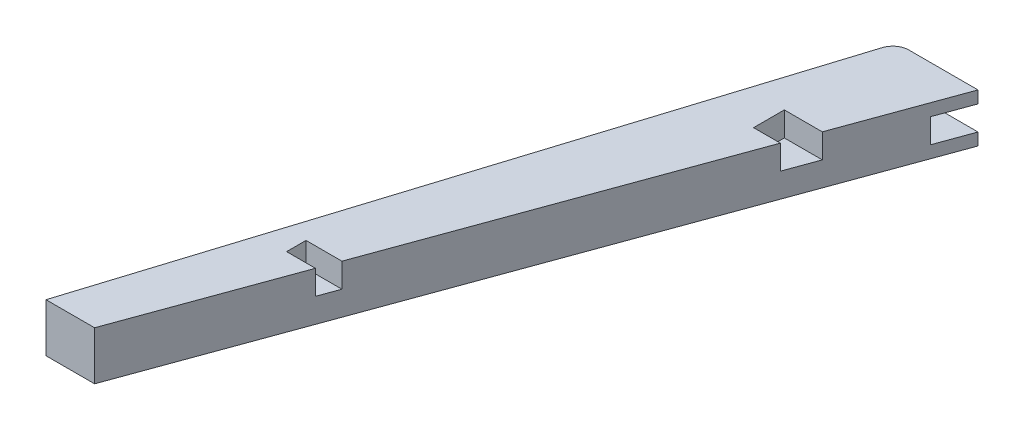
ISO-10303-21;
HEADER;
FILE_DESCRIPTION(('STEP AP214'),'2;1');
FILE_NAME('part.step','',(''),(''),'','','');
FILE_SCHEMA(('AUTOMOTIVE_DESIGN { 1 0 10303 214 1 1 1 1 }'));
ENDSEC;
DATA;
#1=APPLICATION_CONTEXT('core data for automotive mechanical design processes');
#2=APPLICATION_PROTOCOL_DEFINITION('international standard','automotive_design',2000,#1);
#3=PRODUCT_CONTEXT('',#1,'mechanical');
#4=PRODUCT('Part','Part','',(#3));
#5=PRODUCT_RELATED_PRODUCT_CATEGORY('part','',(#4));
#6=PRODUCT_DEFINITION_FORMATION('','',#4);
#7=PRODUCT_DEFINITION_CONTEXT('part definition',#1,'design');
#8=PRODUCT_DEFINITION('design','',#6,#7);
#9=PRODUCT_DEFINITION_SHAPE('','',#8);
#10=(LENGTH_UNIT() NAMED_UNIT(*) SI_UNIT(.MILLI.,.METRE.));
#11=(NAMED_UNIT(*) PLANE_ANGLE_UNIT() SI_UNIT($,.RADIAN.));
#12=(NAMED_UNIT(*) SI_UNIT($,.STERADIAN.) SOLID_ANGLE_UNIT());
#13=UNCERTAINTY_MEASURE_WITH_UNIT(LENGTH_MEASURE(1.E-05),#10,'distance_accuracy_value','');
#14=(GEOMETRIC_REPRESENTATION_CONTEXT(3) GLOBAL_UNCERTAINTY_ASSIGNED_CONTEXT((#13)) GLOBAL_UNIT_ASSIGNED_CONTEXT((#10,
#11,#12)) REPRESENTATION_CONTEXT('',''));
#15=CARTESIAN_POINT('',(0.,0.,0.));
#16=DIRECTION('',(0.,0.,1.));
#17=DIRECTION('',(1.,0.,0.));
#18=AXIS2_PLACEMENT_3D('',#15,#16,#17);
#19=CARTESIAN_POINT('',(-15.,15.,0.));
#20=DIRECTION('',(0.,0.,-1.));
#21=DIRECTION('',(-1.,0.,0.));
#22=AXIS2_PLACEMENT_3D('',#19,#20,#21);
#23=PLANE('',#22);
#24=DIRECTION('',(1.,0.,0.));
#25=VECTOR('',#24,1.);
#26=CARTESIAN_POINT('',(-15.,-15.,0.));
#27=LINE('',#26,#25);
#28=CARTESIAN_POINT('',(-15.,-15.,0.));
#29=VERTEX_POINT('',#28);
#30=CARTESIAN_POINT('',(15.,-15.,0.));
#31=VERTEX_POINT('',#30);
#32=EDGE_CURVE('E234',#29,#31,#27,.T.);
#33=ORIENTED_EDGE('',*,*,#32,.T.);
#34=DIRECTION('',(0.,-1.,0.));
#35=VECTOR('',#34,1.);
#36=CARTESIAN_POINT('',(15.,15.,0.));
#37=LINE('',#36,#35);
#38=CARTESIAN_POINT('',(15.,15.,0.));
#39=VERTEX_POINT('',#38);
#40=EDGE_CURVE('E265',#39,#31,#37,.T.);
#41=ORIENTED_EDGE('',*,*,#40,.F.);
#42=DIRECTION('',(1.,0.,0.));
#43=VECTOR('',#42,1.);
#44=CARTESIAN_POINT('',(-15.,15.,0.));
#45=LINE('',#44,#43);
#46=CARTESIAN_POINT('',(-15.,15.,0.));
#47=VERTEX_POINT('',#46);
#48=EDGE_CURVE('E235',#47,#39,#45,.T.);
#49=ORIENTED_EDGE('',*,*,#48,.F.);
#50=DIRECTION('',(0.,-1.,0.));
#51=VECTOR('',#50,1.);
#52=CARTESIAN_POINT('',(-15.,15.,0.));
#53=LINE('',#52,#51);
#54=EDGE_CURVE('E249',#47,#29,#53,.T.);
#55=ORIENTED_EDGE('',*,*,#54,.T.);
#56=EDGE_LOOP('',(#33,#41,#49,#55));
#57=FACE_BOUND('',#56,.T.);
#58=ADVANCED_FACE('F35',(#57),#23,.F.);
#59=CARTESIAN_POINT('',(15.,15.,0.));
#60=DIRECTION('',(-0.939692620785907,0.,-0.342020143325673));
#61=DIRECTION('',(-0.342020143325673,0.,0.939692620785907));
#62=AXIS2_PLACEMENT_3D('',#59,#60,#61);
#63=PLANE('',#62);
#64=DIRECTION('',(0.342020143325673,0.,-0.939692620785907));
#65=VECTOR('',#64,1.);
#66=CARTESIAN_POINT('',(15.,0.,0.));
#67=LINE('',#66,#65);
#68=CARTESIAN_POINT('',(128.012757739657,0.,-310.5));
#69=VERTEX_POINT('',#68);
#70=CARTESIAN_POINT('',(134.928192190715,0.,-329.5));
#71=VERTEX_POINT('',#70);
#72=EDGE_CURVE('E11',#69,#71,#67,.T.);
#73=ORIENTED_EDGE('',*,*,#72,.F.);
#74=DIRECTION('',(0.,1.,0.));
#75=VECTOR('',#74,1.);
#76=CARTESIAN_POINT('',(128.012757739657,15.,-310.5));
#77=LINE('',#76,#75);
#78=CARTESIAN_POINT('',(128.012757739657,15.,-310.5));
#79=VERTEX_POINT('',#78);
#80=EDGE_CURVE('E205',#69,#79,#77,.T.);
#81=ORIENTED_EDGE('',*,*,#80,.T.);
#82=DIRECTION('',(0.342020143325673,0.,-0.939692620785907));
#83=VECTOR('',#82,1.);
#84=CARTESIAN_POINT('',(15.,15.,0.));
#85=LINE('',#84,#83);
#86=CARTESIAN_POINT('',(55.7646662378152,15.,-112.));
#87=VERTEX_POINT('',#86);
#88=EDGE_CURVE('E244',#87,#79,#85,.T.);
#89=ORIENTED_EDGE('',*,*,#88,.F.);
#90=DIRECTION('',(0.,-1.,0.));
#91=VECTOR('',#90,1.);
#92=CARTESIAN_POINT('',(55.7646662378152,15.,-112.));
#93=LINE('',#92,#91);
#94=CARTESIAN_POINT('',(55.7646662378152,0.,-112.));
#95=VERTEX_POINT('',#94);
#96=EDGE_CURVE('E58',#87,#95,#93,.T.);
#97=ORIENTED_EDGE('',*,*,#96,.T.);
#98=DIRECTION('',(0.342020143325673,0.,-0.939692620785907));
#99=VECTOR('',#98,1.);
#100=CARTESIAN_POINT('',(15.,0.,0.));
#101=LINE('',#100,#99);
#102=CARTESIAN_POINT('',(51.3970234266207,0.,-100.));
#103=VERTEX_POINT('',#102);
#104=EDGE_CURVE('E43',#103,#95,#101,.T.);
#105=ORIENTED_EDGE('',*,*,#104,.F.);
#106=DIRECTION('',(0.,1.,0.));
#107=VECTOR('',#106,1.);
#108=CARTESIAN_POINT('',(51.3970234266207,15.,-100.));
#109=LINE('',#108,#107);
#110=CARTESIAN_POINT('',(51.3970234266207,15.,-100.));
#111=VERTEX_POINT('',#110);
#112=EDGE_CURVE('E201',#103,#111,#109,.T.);
#113=ORIENTED_EDGE('',*,*,#112,.T.);
#114=EDGE_CURVE('E240',#39,#111,#85,.T.);
#115=ORIENTED_EDGE('',*,*,#114,.F.);
#116=ORIENTED_EDGE('',*,*,#40,.T.);
#117=DIRECTION('',(0.342020143325673,0.,-0.939692620785907));
#118=VECTOR('',#117,1.);
#119=CARTESIAN_POINT('',(15.,-15.,0.));
#120=LINE('',#119,#118);
#121=CARTESIAN_POINT('',(160.588093706483,-15.,-400.));
#122=VERTEX_POINT('',#121);
#123=EDGE_CURVE('E252',#31,#122,#120,.T.);
#124=ORIENTED_EDGE('',*,*,#123,.T.);
#125=DIRECTION('',(0.,-1.,0.));
#126=VECTOR('',#125,1.);
#127=CARTESIAN_POINT('',(160.588093706483,15.,-400.));
#128=LINE('',#127,#126);
#129=CARTESIAN_POINT('',(160.588093706483,-7.5,-400.));
#130=VERTEX_POINT('',#129);
#131=EDGE_CURVE('E261',#130,#122,#128,.T.);
#132=ORIENTED_EDGE('',*,*,#131,.F.);
#133=DIRECTION('',(-0.342020143325673,0.,0.939692620785907));
#134=VECTOR('',#133,1.);
#135=CARTESIAN_POINT('',(15.,-7.5,0.));
#136=LINE('',#135,#134);
#137=CARTESIAN_POINT('',(152.744535158046,-7.5,-378.45));
#138=VERTEX_POINT('',#137);
#139=EDGE_CURVE('E227',#130,#138,#136,.T.);
#140=ORIENTED_EDGE('',*,*,#139,.T.);
#141=DIRECTION('',(0.,-1.,0.));
#142=VECTOR('',#141,1.);
#143=CARTESIAN_POINT('',(152.744535158046,15.,-378.45));
#144=LINE('',#143,#142);
#145=CARTESIAN_POINT('',(152.744535158046,7.5,-378.45));
#146=VERTEX_POINT('',#145);
#147=EDGE_CURVE('E268',#146,#138,#144,.T.);
#148=ORIENTED_EDGE('',*,*,#147,.F.);
#149=DIRECTION('',(0.342020143325673,0.,-0.939692620785907));
#150=VECTOR('',#149,1.);
#151=CARTESIAN_POINT('',(15.,7.5,0.));
#152=LINE('',#151,#150);
#153=CARTESIAN_POINT('',(160.588093706483,7.5,-400.));
#154=VERTEX_POINT('',#153);
#155=EDGE_CURVE('E231',#146,#154,#152,.T.);
#156=ORIENTED_EDGE('',*,*,#155,.T.);
#157=CARTESIAN_POINT('',(160.588093706483,15.,-400.));
#158=VERTEX_POINT('',#157);
#159=EDGE_CURVE('E262',#158,#154,#128,.T.);
#160=ORIENTED_EDGE('',*,*,#159,.F.);
#161=CARTESIAN_POINT('',(134.928192190715,15.,-329.5));
#162=VERTEX_POINT('',#161);
#163=EDGE_CURVE('E238',#162,#158,#85,.T.);
#164=ORIENTED_EDGE('',*,*,#163,.F.);
#165=DIRECTION('',(0.,-1.,0.));
#166=VECTOR('',#165,1.);
#167=CARTESIAN_POINT('',(134.928192190715,15.,-329.5));
#168=LINE('',#167,#166);
#169=EDGE_CURVE('E50',#162,#71,#168,.T.);
#170=ORIENTED_EDGE('',*,*,#169,.T.);
#171=EDGE_LOOP('',(#73,#81,#89,#97,#105,#113,#115,#116,#124,#132,#140,#148,#156,#160,#164,#170));
#172=FACE_BOUND('',#171,.T.);
#173=ADVANCED_FACE('F290',(#172),#63,.F.);
#174=CARTESIAN_POINT('',(160.588093706483,15.,-400.));
#175=DIRECTION('',(0.,0.,1.));
#176=DIRECTION('',(1.,0.,0.));
#177=AXIS2_PLACEMENT_3D('',#174,#175,#176);
#178=PLANE('',#177);
#179=DIRECTION('',(-1.,0.,0.));
#180=VECTOR('',#179,1.);
#181=CARTESIAN_POINT('',(160.588093706483,-15.,-400.));
#182=LINE('',#181,#180);
#183=CARTESIAN_POINT('',(117.929695233117,-15.,-400.));
#184=VERTEX_POINT('',#183);
#185=EDGE_CURVE('E255',#122,#184,#182,.T.);
#186=ORIENTED_EDGE('',*,*,#185,.T.);
#187=DIRECTION('',(0.,-1.,0.));
#188=VECTOR('',#187,1.);
#189=CARTESIAN_POINT('',(117.929695233117,15.,-400.));
#190=LINE('',#189,#188);
#191=CARTESIAN_POINT('',(117.929695233117,15.,-400.));
#192=VERTEX_POINT('',#191);
#193=EDGE_CURVE('E275',#184,#192,#190,.F.);
#194=ORIENTED_EDGE('',*,*,#193,.T.);
#195=DIRECTION('',(-1.,0.,0.));
#196=VECTOR('',#195,1.);
#197=CARTESIAN_POINT('',(160.588093706483,15.,-400.));
#198=LINE('',#197,#196);
#199=EDGE_CURVE('E243',#158,#192,#198,.T.);
#200=ORIENTED_EDGE('',*,*,#199,.F.);
#201=ORIENTED_EDGE('',*,*,#159,.T.);
#202=DIRECTION('',(1.,0.,0.));
#203=VECTOR('',#202,1.);
#204=CARTESIAN_POINT('',(160.588093706483,7.5,-400.));
#205=LINE('',#204,#203);
#206=CARTESIAN_POINT('',(135.588093706483,7.5,-400.));
#207=VERTEX_POINT('',#206);
#208=EDGE_CURVE('E212',#207,#154,#205,.T.);
#209=ORIENTED_EDGE('',*,*,#208,.F.);
#210=DIRECTION('',(0.,1.,0.));
#211=VECTOR('',#210,1.);
#212=CARTESIAN_POINT('',(135.588093706483,7.5,-400.));
#213=LINE('',#212,#211);
#214=CARTESIAN_POINT('',(135.588093706483,-7.5,-400.));
#215=VERTEX_POINT('',#214);
#216=EDGE_CURVE('E221',#215,#207,#213,.T.);
#217=ORIENTED_EDGE('',*,*,#216,.F.);
#218=DIRECTION('',(-1.,0.,0.));
#219=VECTOR('',#218,1.);
#220=CARTESIAN_POINT('',(160.588093706483,-7.5,-400.));
#221=LINE('',#220,#219);
#222=EDGE_CURVE('E208',#130,#215,#221,.T.);
#223=ORIENTED_EDGE('',*,*,#222,.F.);
#224=ORIENTED_EDGE('',*,*,#131,.T.);
#225=EDGE_LOOP('',(#186,#194,#200,#201,#209,#217,#223,#224));
#226=FACE_BOUND('',#225,.T.);
#227=ADVANCED_FACE('F302',(#226),#178,.F.);
#228=CARTESIAN_POINT('',(110.588093706483,15.,-400.));
#229=DIRECTION('',(0.954079771438947,0.,0.299552649347335));
#230=DIRECTION('',(0.299552649347335,0.,-0.954079771438947));
#231=AXIS2_PLACEMENT_3D('',#228,#229,#230);
#232=PLANE('',#231);
#233=DIRECTION('',(-0.299552649347335,0.,0.954079771438947));
#234=VECTOR('',#233,1.);
#235=CARTESIAN_POINT('',(110.588093706483,15.,-400.));
#236=LINE('',#235,#234);
#237=CARTESIAN_POINT('',(108.388897518727,15.,-392.995526493473));
#238=VERTEX_POINT('',#237);
#239=EDGE_CURVE('E247',#238,#47,#236,.T.);
#240=ORIENTED_EDGE('',*,*,#239,.F.);
#241=DIRECTION('',(0.,-1.,0.));
#242=VECTOR('',#241,1.);
#243=CARTESIAN_POINT('',(108.388897518727,15.,-392.995526493473));
#244=LINE('',#243,#242);
#245=CARTESIAN_POINT('',(108.388897518727,-15.,-392.995526493473));
#246=VERTEX_POINT('',#245);
#247=EDGE_CURVE('E270',#238,#246,#244,.T.);
#248=ORIENTED_EDGE('',*,*,#247,.T.);
#249=DIRECTION('',(-0.299552649347335,0.,0.954079771438947));
#250=VECTOR('',#249,1.);
#251=CARTESIAN_POINT('',(110.588093706483,-15.,-400.));
#252=LINE('',#251,#250);
#253=EDGE_CURVE('E239',#246,#29,#252,.T.);
#254=ORIENTED_EDGE('',*,*,#253,.T.);
#255=ORIENTED_EDGE('',*,*,#54,.F.);
#256=EDGE_LOOP('',(#240,#248,#254,#255));
#257=FACE_BOUND('',#256,.T.);
#258=ADVANCED_FACE('F310',(#257),#232,.F.);
#259=CARTESIAN_POINT('',(0.,15.,0.));
#260=DIRECTION('',(0.,-1.,0.));
#261=DIRECTION('',(0.,0.,-1.));
#262=AXIS2_PLACEMENT_3D('',#259,#260,#261);
#263=PLANE('',#262);
#264=ORIENTED_EDGE('',*,*,#88,.T.);
#265=DIRECTION('',(1.,0.,0.));
#266=VECTOR('',#265,1.);
#267=CARTESIAN_POINT('',(111.470474965186,15.,-310.5));
#268=LINE('',#267,#266);
#269=CARTESIAN_POINT('',(111.470474965186,15.,-310.5));
#270=VERTEX_POINT('',#269);
#271=EDGE_CURVE('E162',#270,#79,#268,.T.);
#272=ORIENTED_EDGE('',*,*,#271,.F.);
#273=DIRECTION('',(0.,0.,1.));
#274=VECTOR('',#273,1.);
#275=CARTESIAN_POINT('',(111.470474965186,15.,-329.5));
#276=LINE('',#275,#274);
#277=CARTESIAN_POINT('',(111.470474965186,15.,-329.5));
#278=VERTEX_POINT('',#277);
#279=EDGE_CURVE('E178',#278,#270,#276,.T.);
#280=ORIENTED_EDGE('',*,*,#279,.F.);
#281=DIRECTION('',(1.,0.,0.));
#282=VECTOR('',#281,1.);
#283=CARTESIAN_POINT('',(0.,15.,-329.5));
#284=LINE('',#283,#282);
#285=EDGE_CURVE('E167',#278,#162,#284,.T.);
#286=ORIENTED_EDGE('',*,*,#285,.T.);
#287=ORIENTED_EDGE('',*,*,#163,.T.);
#288=ORIENTED_EDGE('',*,*,#199,.T.);
#289=CARTESIAN_POINT('',(117.929695233117,15.,-390.));
#290=DIRECTION('',(0.,-1.,0.));
#291=DIRECTION('',(0.,0.,-1.));
#292=AXIS2_PLACEMENT_3D('',#289,#290,#291);
#293=CIRCLE('',#292,10.);
#294=EDGE_CURVE('E277',#192,#238,#293,.F.);
#295=ORIENTED_EDGE('',*,*,#294,.T.);
#296=ORIENTED_EDGE('',*,*,#239,.T.);
#297=ORIENTED_EDGE('',*,*,#48,.T.);
#298=ORIENTED_EDGE('',*,*,#114,.T.);
#299=DIRECTION('',(1.,0.,0.));
#300=VECTOR('',#299,1.);
#301=CARTESIAN_POINT('',(33.5808448322179,15.,-100.));
#302=LINE('',#301,#300);
#303=CARTESIAN_POINT('',(33.5808448322179,15.,-100.));
#304=VERTEX_POINT('',#303);
#305=EDGE_CURVE('E186',#304,#111,#302,.T.);
#306=ORIENTED_EDGE('',*,*,#305,.F.);
#307=DIRECTION('',(0.,0.,1.));
#308=VECTOR('',#307,1.);
#309=CARTESIAN_POINT('',(33.5808448322179,15.,-112.));
#310=LINE('',#309,#308);
#311=CARTESIAN_POINT('',(33.5808448322179,15.,-112.));
#312=VERTEX_POINT('',#311);
#313=EDGE_CURVE('E193',#312,#304,#310,.T.);
#314=ORIENTED_EDGE('',*,*,#313,.F.);
#315=DIRECTION('',(1.,0.,0.));
#316=VECTOR('',#315,1.);
#317=CARTESIAN_POINT('',(0.,15.,-112.));
#318=LINE('',#317,#316);
#319=EDGE_CURVE('E279',#312,#87,#318,.T.);
#320=ORIENTED_EDGE('',*,*,#319,.T.);
#321=EDGE_LOOP('',(#264,#272,#280,#286,#287,#288,#295,#296,#297,#298,#306,#314,#320));
#322=FACE_BOUND('',#321,.T.);
#323=ADVANCED_FACE('F296',(#322),#263,.F.);
#324=CARTESIAN_POINT('',(0.,-15.,0.));
#325=DIRECTION('',(0.,-1.,0.));
#326=DIRECTION('',(0.,0.,-1.));
#327=AXIS2_PLACEMENT_3D('',#324,#325,#326);
#328=PLANE('',#327);
#329=ORIENTED_EDGE('',*,*,#253,.F.);
#330=CARTESIAN_POINT('',(117.929695233117,-15.,-390.));
#331=DIRECTION('',(0.,-1.,0.));
#332=DIRECTION('',(0.,0.,-1.));
#333=AXIS2_PLACEMENT_3D('',#330,#331,#332);
#334=CIRCLE('',#333,10.);
#335=EDGE_CURVE('E273',#246,#184,#334,.T.);
#336=ORIENTED_EDGE('',*,*,#335,.T.);
#337=ORIENTED_EDGE('',*,*,#185,.F.);
#338=ORIENTED_EDGE('',*,*,#123,.F.);
#339=ORIENTED_EDGE('',*,*,#32,.F.);
#340=EDGE_LOOP('',(#329,#336,#337,#338,#339));
#341=FACE_BOUND('',#340,.T.);
#342=ADVANCED_FACE('F342',(#341),#328,.T.);
#343=CARTESIAN_POINT('',(0.,0.,-378.45));
#344=DIRECTION('',(0.,0.,-1.));
#345=DIRECTION('',(-1.,0.,0.));
#346=AXIS2_PLACEMENT_3D('',#343,#344,#345);
#347=PLANE('',#346);
#348=ORIENTED_EDGE('',*,*,#147,.T.);
#349=DIRECTION('',(-1.,0.,0.));
#350=VECTOR('',#349,1.);
#351=CARTESIAN_POINT('',(160.588093706483,-7.5,-378.45));
#352=LINE('',#351,#350);
#353=CARTESIAN_POINT('',(135.588093706483,-7.5,-378.45));
#354=VERTEX_POINT('',#353);
#355=EDGE_CURVE('E209',#138,#354,#352,.T.);
#356=ORIENTED_EDGE('',*,*,#355,.T.);
#357=DIRECTION('',(0.,1.,0.));
#358=VECTOR('',#357,1.);
#359=CARTESIAN_POINT('',(135.588093706483,7.5,-378.45));
#360=LINE('',#359,#358);
#361=CARTESIAN_POINT('',(135.588093706483,7.5,-378.45));
#362=VERTEX_POINT('',#361);
#363=EDGE_CURVE('E211',#354,#362,#360,.T.);
#364=ORIENTED_EDGE('',*,*,#363,.T.);
#365=DIRECTION('',(1.,0.,0.));
#366=VECTOR('',#365,1.);
#367=CARTESIAN_POINT('',(160.588093706483,7.5,-378.45));
#368=LINE('',#367,#366);
#369=EDGE_CURVE('E215',#362,#146,#368,.T.);
#370=ORIENTED_EDGE('',*,*,#369,.T.);
#371=EDGE_LOOP('',(#348,#356,#364,#370));
#372=FACE_BOUND('',#371,.T.);
#373=ADVANCED_FACE('F345',(#372),#347,.T.);
#374=CARTESIAN_POINT('',(160.588093706483,7.5,-378.45));
#375=DIRECTION('',(0.,1.,0.));
#376=DIRECTION('',(0.,0.,1.));
#377=AXIS2_PLACEMENT_3D('',#374,#375,#376);
#378=PLANE('',#377);
#379=ORIENTED_EDGE('',*,*,#369,.F.);
#380=DIRECTION('',(0.,0.,-1.));
#381=VECTOR('',#380,1.);
#382=CARTESIAN_POINT('',(135.588093706483,7.5,-378.45));
#383=LINE('',#382,#381);
#384=EDGE_CURVE('E225',#362,#207,#383,.T.);
#385=ORIENTED_EDGE('',*,*,#384,.T.);
#386=ORIENTED_EDGE('',*,*,#208,.T.);
#387=ORIENTED_EDGE('',*,*,#155,.F.);
#388=EDGE_LOOP('',(#379,#385,#386,#387));
#389=FACE_BOUND('',#388,.T.);
#390=ADVANCED_FACE('F353',(#389),#378,.F.);
#391=CARTESIAN_POINT('',(160.588093706483,-7.5,-378.45));
#392=DIRECTION('',(0.,-1.,0.));
#393=DIRECTION('',(0.,0.,-1.));
#394=AXIS2_PLACEMENT_3D('',#391,#392,#393);
#395=PLANE('',#394);
#396=ORIENTED_EDGE('',*,*,#222,.T.);
#397=DIRECTION('',(0.,0.,-1.));
#398=VECTOR('',#397,1.);
#399=CARTESIAN_POINT('',(135.588093706483,-7.5,-378.45));
#400=LINE('',#399,#398);
#401=EDGE_CURVE('E218',#354,#215,#400,.T.);
#402=ORIENTED_EDGE('',*,*,#401,.F.);
#403=ORIENTED_EDGE('',*,*,#355,.F.);
#404=ORIENTED_EDGE('',*,*,#139,.F.);
#405=EDGE_LOOP('',(#396,#402,#403,#404));
#406=FACE_BOUND('',#405,.T.);
#407=ADVANCED_FACE('F349',(#406),#395,.F.);
#408=CARTESIAN_POINT('',(135.588093706483,7.5,-378.45));
#409=DIRECTION('',(-1.,0.,0.));
#410=DIRECTION('',(0.,0.,1.));
#411=AXIS2_PLACEMENT_3D('',#408,#409,#410);
#412=PLANE('',#411);
#413=ORIENTED_EDGE('',*,*,#216,.T.);
#414=ORIENTED_EDGE('',*,*,#384,.F.);
#415=ORIENTED_EDGE('',*,*,#363,.F.);
#416=ORIENTED_EDGE('',*,*,#401,.T.);
#417=EDGE_LOOP('',(#413,#414,#415,#416));
#418=FACE_BOUND('',#417,.T.);
#419=ADVANCED_FACE('F352',(#418),#412,.F.);
#420=CARTESIAN_POINT('',(117.929695233117,15.,-390.));
#421=DIRECTION('',(0.,-1.,0.));
#422=DIRECTION('',(0.,0.,-1.));
#423=AXIS2_PLACEMENT_3D('',#420,#421,#422);
#424=CYLINDRICAL_SURFACE('',#423,10.);
#425=ORIENTED_EDGE('',*,*,#294,.F.);
#426=ORIENTED_EDGE('',*,*,#193,.F.);
#427=ORIENTED_EDGE('',*,*,#335,.F.);
#428=ORIENTED_EDGE('',*,*,#247,.F.);
#429=EDGE_LOOP('',(#425,#426,#427,#428));
#430=FACE_BOUND('',#429,.T.);
#431=ADVANCED_FACE('F37',(#430),#424,.T.);
#432=CARTESIAN_POINT('',(0.,0.,0.));
#433=DIRECTION('',(0.,1.,0.));
#434=DIRECTION('',(0.,0.,1.));
#435=AXIS2_PLACEMENT_3D('',#432,#433,#434);
#436=PLANE('',#435);
#437=ORIENTED_EDGE('',*,*,#104,.T.);
#438=DIRECTION('',(-1.,0.,0.));
#439=VECTOR('',#438,1.);
#440=CARTESIAN_POINT('',(33.5808448322179,0.,-112.));
#441=LINE('',#440,#439);
#442=CARTESIAN_POINT('',(33.5808448322179,0.,-112.));
#443=VERTEX_POINT('',#442);
#444=EDGE_CURVE('E183',#95,#443,#441,.T.);
#445=ORIENTED_EDGE('',*,*,#444,.T.);
#446=DIRECTION('',(0.,0.,1.));
#447=VECTOR('',#446,1.);
#448=CARTESIAN_POINT('',(33.5808448322179,0.,-112.));
#449=LINE('',#448,#447);
#450=CARTESIAN_POINT('',(33.5808448322179,0.,-100.));
#451=VERTEX_POINT('',#450);
#452=EDGE_CURVE('E185',#443,#451,#449,.T.);
#453=ORIENTED_EDGE('',*,*,#452,.T.);
#454=DIRECTION('',(1.,0.,0.));
#455=VECTOR('',#454,1.);
#456=CARTESIAN_POINT('',(33.5808448322179,0.,-100.));
#457=LINE('',#456,#455);
#458=EDGE_CURVE('E189',#451,#103,#457,.T.);
#459=ORIENTED_EDGE('',*,*,#458,.T.);
#460=EDGE_LOOP('',(#437,#445,#453,#459));
#461=FACE_BOUND('',#460,.T.);
#462=ADVANCED_FACE('F283',(#461),#436,.T.);
#463=CARTESIAN_POINT('',(33.5808448322179,0.,-100.));
#464=DIRECTION('',(0.,0.,1.));
#465=DIRECTION('',(1.,0.,0.));
#466=AXIS2_PLACEMENT_3D('',#463,#464,#465);
#467=PLANE('',#466);
#468=ORIENTED_EDGE('',*,*,#458,.F.);
#469=DIRECTION('',(0.,1.,0.));
#470=VECTOR('',#469,1.);
#471=CARTESIAN_POINT('',(33.5808448322179,0.,-100.));
#472=LINE('',#471,#470);
#473=EDGE_CURVE('E180',#451,#304,#472,.T.);
#474=ORIENTED_EDGE('',*,*,#473,.T.);
#475=ORIENTED_EDGE('',*,*,#305,.T.);
#476=ORIENTED_EDGE('',*,*,#112,.F.);
#477=EDGE_LOOP('',(#468,#474,#475,#476));
#478=FACE_BOUND('',#477,.T.);
#479=ADVANCED_FACE('F319',(#478),#467,.F.);
#480=CARTESIAN_POINT('',(33.5808448322179,0.,-112.));
#481=DIRECTION('',(0.,0.,-1.));
#482=DIRECTION('',(-1.,0.,0.));
#483=AXIS2_PLACEMENT_3D('',#480,#481,#482);
#484=PLANE('',#483);
#485=ORIENTED_EDGE('',*,*,#319,.F.);
#486=DIRECTION('',(0.,1.,0.));
#487=VECTOR('',#486,1.);
#488=CARTESIAN_POINT('',(33.5808448322179,0.,-112.));
#489=LINE('',#488,#487);
#490=EDGE_CURVE('E192',#443,#312,#489,.T.);
#491=ORIENTED_EDGE('',*,*,#490,.F.);
#492=ORIENTED_EDGE('',*,*,#444,.F.);
#493=ORIENTED_EDGE('',*,*,#96,.F.);
#494=EDGE_LOOP('',(#485,#491,#492,#493));
#495=FACE_BOUND('',#494,.T.);
#496=ADVANCED_FACE('F287',(#495),#484,.F.);
#497=CARTESIAN_POINT('',(33.5808448322179,0.,-112.));
#498=DIRECTION('',(-1.,0.,0.));
#499=DIRECTION('',(0.,0.,1.));
#500=AXIS2_PLACEMENT_3D('',#497,#498,#499);
#501=PLANE('',#500);
#502=ORIENTED_EDGE('',*,*,#313,.T.);
#503=ORIENTED_EDGE('',*,*,#473,.F.);
#504=ORIENTED_EDGE('',*,*,#452,.F.);
#505=ORIENTED_EDGE('',*,*,#490,.T.);
#506=EDGE_LOOP('',(#502,#503,#504,#505));
#507=FACE_BOUND('',#506,.T.);
#508=ADVANCED_FACE('F321',(#507),#501,.F.);
#509=CARTESIAN_POINT('',(0.,0.,0.));
#510=DIRECTION('',(0.,1.,0.));
#511=DIRECTION('',(0.,0.,1.));
#512=AXIS2_PLACEMENT_3D('',#509,#510,#511);
#513=PLANE('',#512);
#514=ORIENTED_EDGE('',*,*,#72,.T.);
#515=DIRECTION('',(-1.,0.,0.));
#516=VECTOR('',#515,1.);
#517=CARTESIAN_POINT('',(111.470474965186,0.,-329.5));
#518=LINE('',#517,#516);
#519=CARTESIAN_POINT('',(111.470474965186,0.,-329.5));
#520=VERTEX_POINT('',#519);
#521=EDGE_CURVE('E154',#71,#520,#518,.T.);
#522=ORIENTED_EDGE('',*,*,#521,.T.);
#523=DIRECTION('',(0.,0.,1.));
#524=VECTOR('',#523,1.);
#525=CARTESIAN_POINT('',(111.470474965186,0.,-329.5));
#526=LINE('',#525,#524);
#527=CARTESIAN_POINT('',(111.470474965186,0.,-310.5));
#528=VERTEX_POINT('',#527);
#529=EDGE_CURVE('E159',#520,#528,#526,.T.);
#530=ORIENTED_EDGE('',*,*,#529,.T.);
#531=DIRECTION('',(1.,0.,0.));
#532=VECTOR('',#531,1.);
#533=CARTESIAN_POINT('',(111.470474965186,0.,-310.5));
#534=LINE('',#533,#532);
#535=EDGE_CURVE('E172',#528,#69,#534,.T.);
#536=ORIENTED_EDGE('',*,*,#535,.T.);
#537=EDGE_LOOP('',(#514,#522,#530,#536));
#538=FACE_BOUND('',#537,.T.);
#539=ADVANCED_FACE('F156',(#538),#513,.T.);
#540=CARTESIAN_POINT('',(111.470474965186,0.,-310.5));
#541=DIRECTION('',(0.,0.,1.));
#542=DIRECTION('',(1.,0.,0.));
#543=AXIS2_PLACEMENT_3D('',#540,#541,#542);
#544=PLANE('',#543);
#545=ORIENTED_EDGE('',*,*,#535,.F.);
#546=DIRECTION('',(0.,1.,0.));
#547=VECTOR('',#546,1.);
#548=CARTESIAN_POINT('',(111.470474965186,0.,-310.5));
#549=LINE('',#548,#547);
#550=EDGE_CURVE('E171',#528,#270,#549,.T.);
#551=ORIENTED_EDGE('',*,*,#550,.T.);
#552=ORIENTED_EDGE('',*,*,#271,.T.);
#553=ORIENTED_EDGE('',*,*,#80,.F.);
#554=EDGE_LOOP('',(#545,#551,#552,#553));
#555=FACE_BOUND('',#554,.T.);
#556=ADVANCED_FACE('F328',(#555),#544,.F.);
#557=CARTESIAN_POINT('',(111.470474965186,0.,-329.5));
#558=DIRECTION('',(0.,0.,-1.));
#559=DIRECTION('',(-1.,0.,0.));
#560=AXIS2_PLACEMENT_3D('',#557,#558,#559);
#561=PLANE('',#560);
#562=ORIENTED_EDGE('',*,*,#285,.F.);
#563=DIRECTION('',(0.,1.,0.));
#564=VECTOR('',#563,1.);
#565=CARTESIAN_POINT('',(111.470474965186,0.,-329.5));
#566=LINE('',#565,#564);
#567=EDGE_CURVE('E165',#520,#278,#566,.T.);
#568=ORIENTED_EDGE('',*,*,#567,.F.);
#569=ORIENTED_EDGE('',*,*,#521,.F.);
#570=ORIENTED_EDGE('',*,*,#169,.F.);
#571=EDGE_LOOP('',(#562,#568,#569,#570));
#572=FACE_BOUND('',#571,.T.);
#573=ADVANCED_FACE('F166',(#572),#561,.F.);
#574=CARTESIAN_POINT('',(111.470474965186,0.,-329.5));
#575=DIRECTION('',(-1.,0.,0.));
#576=DIRECTION('',(0.,0.,1.));
#577=AXIS2_PLACEMENT_3D('',#574,#575,#576);
#578=PLANE('',#577);
#579=ORIENTED_EDGE('',*,*,#279,.T.);
#580=ORIENTED_EDGE('',*,*,#550,.F.);
#581=ORIENTED_EDGE('',*,*,#529,.F.);
#582=ORIENTED_EDGE('',*,*,#567,.T.);
#583=EDGE_LOOP('',(#579,#580,#581,#582));
#584=FACE_BOUND('',#583,.T.);
#585=ADVANCED_FACE('F174',(#584),#578,.F.);
#586=CLOSED_SHELL('',(#58,#173,#227,#258,#323,#342,#373,#390,#407,#419,#431,#462,#479,#496,#508,
#539,#556,#573,#585));
#587=MANIFOLD_SOLID_BREP('B2',#586);
#588=ADVANCED_BREP_SHAPE_REPRESENTATION('',(#18,#587),#14);
#589=SHAPE_DEFINITION_REPRESENTATION(#9,#588);
ENDSEC;
END-ISO-10303-21;
